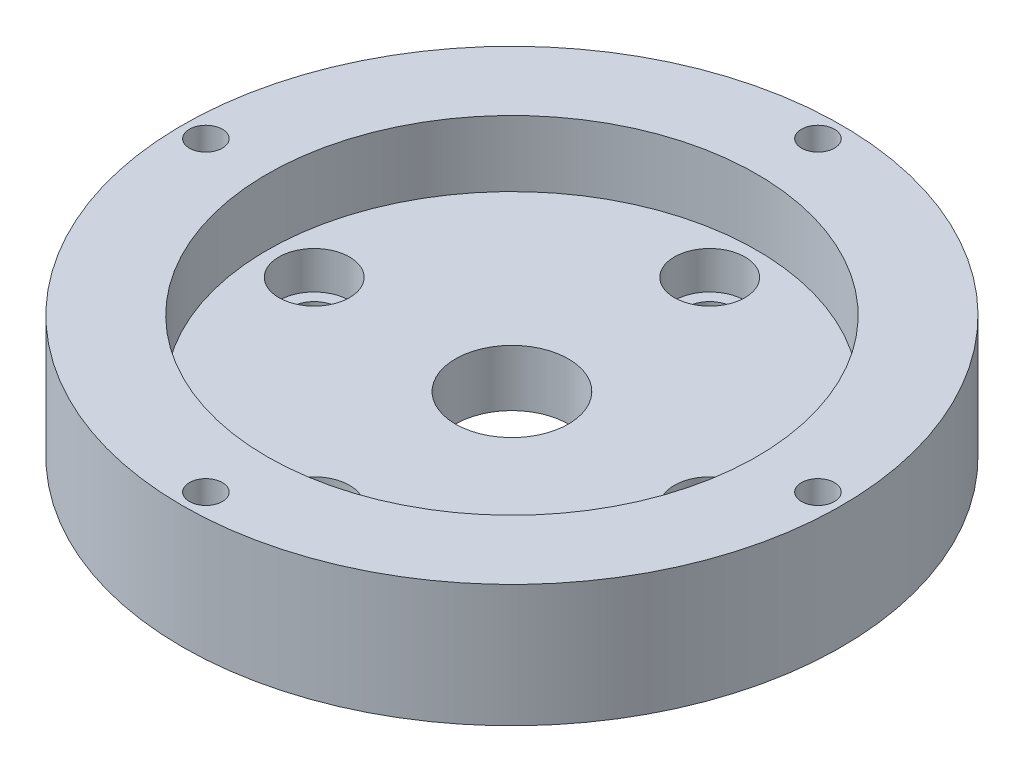
ISO-10303-21;
HEADER;
FILE_DESCRIPTION(('STEP AP214'),'2;1');
FILE_NAME('part.step','',(''),(''),'','','');
FILE_SCHEMA(('AUTOMOTIVE_DESIGN { 1 0 10303 214 1 1 1 1 }'));
ENDSEC;
DATA;
#1=APPLICATION_CONTEXT('core data for automotive mechanical design processes');
#2=APPLICATION_PROTOCOL_DEFINITION('international standard','automotive_design',2000,#1);
#3=PRODUCT_CONTEXT('',#1,'mechanical');
#4=PRODUCT('Part','Part','',(#3));
#5=PRODUCT_RELATED_PRODUCT_CATEGORY('part','',(#4));
#6=PRODUCT_DEFINITION_FORMATION('','',#4);
#7=PRODUCT_DEFINITION_CONTEXT('part definition',#1,'design');
#8=PRODUCT_DEFINITION('design','',#6,#7);
#9=PRODUCT_DEFINITION_SHAPE('','',#8);
#10=(LENGTH_UNIT() NAMED_UNIT(*) SI_UNIT(.MILLI.,.METRE.));
#11=(NAMED_UNIT(*) PLANE_ANGLE_UNIT() SI_UNIT($,.RADIAN.));
#12=(NAMED_UNIT(*) SI_UNIT($,.STERADIAN.) SOLID_ANGLE_UNIT());
#13=UNCERTAINTY_MEASURE_WITH_UNIT(LENGTH_MEASURE(1.E-05),#10,'distance_accuracy_value','');
#14=(GEOMETRIC_REPRESENTATION_CONTEXT(3) GLOBAL_UNCERTAINTY_ASSIGNED_CONTEXT((#13)) GLOBAL_UNIT_ASSIGNED_CONTEXT((#10,
#11,#12)) REPRESENTATION_CONTEXT('',''));
#15=CARTESIAN_POINT('',(0.,0.,0.));
#16=DIRECTION('',(0.,0.,1.));
#17=DIRECTION('',(1.,0.,0.));
#18=AXIS2_PLACEMENT_3D('',#15,#16,#17);
#19=CARTESIAN_POINT('',(-32.5,0.,0.));
#20=DIRECTION('',(0.,1.,0.));
#21=DIRECTION('',(0.,0.,1.));
#22=AXIS2_PLACEMENT_3D('',#19,#20,#21);
#23=CYLINDRICAL_SURFACE('',#22,1.75);
#24=CARTESIAN_POINT('',(-32.5,13.,0.));
#25=DIRECTION('',(0.,1.,0.));
#26=DIRECTION('',(0.,0.,1.));
#27=AXIS2_PLACEMENT_3D('',#24,#25,#26);
#28=CIRCLE('',#27,1.75);
#29=CARTESIAN_POINT('',(-32.5,13.,1.75000000000001));
#30=VERTEX_POINT('',#29);
#31=EDGE_CURVE('E62',#30,#30,#28,.T.);
#32=ORIENTED_EDGE('',*,*,#31,.T.);
#33=EDGE_LOOP('',(#32));
#34=FACE_BOUND('',#33,.T.);
#35=CARTESIAN_POINT('',(-32.5,3.,0.));
#36=DIRECTION('',(0.,-1.,0.));
#37=DIRECTION('',(0.,0.,-1.));
#38=AXIS2_PLACEMENT_3D('',#35,#36,#37);
#39=CIRCLE('',#38,1.75);
#40=CARTESIAN_POINT('',(-32.5,3.,-1.75));
#41=VERTEX_POINT('',#40);
#42=EDGE_CURVE('E36',#41,#41,#39,.F.);
#43=ORIENTED_EDGE('',*,*,#42,.F.);
#44=EDGE_LOOP('',(#43));
#45=FACE_BOUND('',#44,.T.);
#46=ADVANCED_FACE('F32',(#34,#45),#23,.F.);
#47=CARTESIAN_POINT('',(0.,0.,32.5));
#48=DIRECTION('',(0.,1.,0.));
#49=DIRECTION('',(0.,0.,1.));
#50=AXIS2_PLACEMENT_3D('',#47,#48,#49);
#51=CYLINDRICAL_SURFACE('',#50,1.75);
#52=CARTESIAN_POINT('',(0.,13.,32.5));
#53=DIRECTION('',(0.,1.,0.));
#54=DIRECTION('',(0.,0.,1.));
#55=AXIS2_PLACEMENT_3D('',#52,#53,#54);
#56=CIRCLE('',#55,1.75);
#57=CARTESIAN_POINT('',(0.,13.,34.25));
#58=VERTEX_POINT('',#57);
#59=EDGE_CURVE('E66',#58,#58,#56,.T.);
#60=ORIENTED_EDGE('',*,*,#59,.T.);
#61=EDGE_LOOP('',(#60));
#62=FACE_BOUND('',#61,.T.);
#63=CARTESIAN_POINT('',(0.,3.,32.5));
#64=DIRECTION('',(0.,-1.,0.));
#65=DIRECTION('',(0.,0.,-1.));
#66=AXIS2_PLACEMENT_3D('',#63,#64,#65);
#67=CIRCLE('',#66,1.75);
#68=CARTESIAN_POINT('',(0.,3.,30.75));
#69=VERTEX_POINT('',#68);
#70=EDGE_CURVE('E57',#69,#69,#67,.F.);
#71=ORIENTED_EDGE('',*,*,#70,.F.);
#72=EDGE_LOOP('',(#71));
#73=FACE_BOUND('',#72,.T.);
#74=ADVANCED_FACE('F169',(#62,#73),#51,.F.);
#75=CARTESIAN_POINT('',(32.5,0.,0.));
#76=DIRECTION('',(0.,1.,0.));
#77=DIRECTION('',(0.,0.,1.));
#78=AXIS2_PLACEMENT_3D('',#75,#76,#77);
#79=CYLINDRICAL_SURFACE('',#78,1.75);
#80=CARTESIAN_POINT('',(32.5,13.,0.));
#81=DIRECTION('',(0.,1.,0.));
#82=DIRECTION('',(0.,0.,1.));
#83=AXIS2_PLACEMENT_3D('',#80,#81,#82);
#84=CIRCLE('',#83,1.75);
#85=CARTESIAN_POINT('',(32.5,13.,1.75));
#86=VERTEX_POINT('',#85);
#87=EDGE_CURVE('E71',#86,#86,#84,.T.);
#88=ORIENTED_EDGE('',*,*,#87,.T.);
#89=EDGE_LOOP('',(#88));
#90=FACE_BOUND('',#89,.T.);
#91=CARTESIAN_POINT('',(32.5,3.,0.));
#92=DIRECTION('',(0.,-1.,0.));
#93=DIRECTION('',(0.,0.,-1.));
#94=AXIS2_PLACEMENT_3D('',#91,#92,#93);
#95=CIRCLE('',#94,1.75);
#96=CARTESIAN_POINT('',(32.5,3.,-1.75000000000001));
#97=VERTEX_POINT('',#96);
#98=EDGE_CURVE('E54',#97,#97,#95,.F.);
#99=ORIENTED_EDGE('',*,*,#98,.F.);
#100=EDGE_LOOP('',(#99));
#101=FACE_BOUND('',#100,.T.);
#102=ADVANCED_FACE('F163',(#90,#101),#79,.F.);
#103=CARTESIAN_POINT('',(0.,0.,-32.5));
#104=DIRECTION('',(0.,1.,0.));
#105=DIRECTION('',(0.,0.,1.));
#106=AXIS2_PLACEMENT_3D('',#103,#104,#105);
#107=CYLINDRICAL_SURFACE('',#106,1.75);
#108=CARTESIAN_POINT('',(0.,13.,-32.5));
#109=DIRECTION('',(0.,1.,0.));
#110=DIRECTION('',(0.,0.,1.));
#111=AXIS2_PLACEMENT_3D('',#108,#109,#110);
#112=CIRCLE('',#111,1.75);
#113=CARTESIAN_POINT('',(0.,13.,-30.75));
#114=VERTEX_POINT('',#113);
#115=EDGE_CURVE('E79',#114,#114,#112,.T.);
#116=ORIENTED_EDGE('',*,*,#115,.T.);
#117=EDGE_LOOP('',(#116));
#118=FACE_BOUND('',#117,.T.);
#119=CARTESIAN_POINT('',(0.,3.,-32.5));
#120=DIRECTION('',(0.,-1.,0.));
#121=DIRECTION('',(0.,0.,-1.));
#122=AXIS2_PLACEMENT_3D('',#119,#120,#121);
#123=CIRCLE('',#122,1.75);
#124=CARTESIAN_POINT('',(0.,3.,-34.25));
#125=VERTEX_POINT('',#124);
#126=EDGE_CURVE('E51',#125,#125,#123,.F.);
#127=ORIENTED_EDGE('',*,*,#126,.F.);
#128=EDGE_LOOP('',(#127));
#129=FACE_BOUND('',#128,.T.);
#130=ADVANCED_FACE('F155',(#118,#129),#107,.F.);
#131=CARTESIAN_POINT('',(0.,6.,0.));
#132=DIRECTION('',(0.,1.,0.));
#133=DIRECTION('',(0.,0.,1.));
#134=AXIS2_PLACEMENT_3D('',#131,#132,#133);
#135=PLANE('',#134);
#136=CARTESIAN_POINT('',(0.,6.,0.));
#137=DIRECTION('',(0.,1.,0.));
#138=DIRECTION('',(0.,0.,1.));
#139=AXIS2_PLACEMENT_3D('',#136,#137,#138);
#140=CIRCLE('',#139,6.);
#141=CARTESIAN_POINT('',(0.,6.,6.));
#142=VERTEX_POINT('',#141);
#143=EDGE_CURVE('E92',#142,#142,#140,.T.);
#144=ORIENTED_EDGE('',*,*,#143,.F.);
#145=EDGE_LOOP('',(#144));
#146=FACE_BOUND('',#145,.T.);
#147=CARTESIAN_POINT('',(0.,6.,-21.));
#148=DIRECTION('',(0.,1.,0.));
#149=DIRECTION('',(0.,0.,1.));
#150=AXIS2_PLACEMENT_3D('',#147,#148,#149);
#151=CIRCLE('',#150,3.75);
#152=CARTESIAN_POINT('',(0.,6.,-17.25));
#153=VERTEX_POINT('',#152);
#154=EDGE_CURVE('E103',#153,#153,#151,.T.);
#155=ORIENTED_EDGE('',*,*,#154,.F.);
#156=EDGE_LOOP('',(#155));
#157=FACE_BOUND('',#156,.T.);
#158=CARTESIAN_POINT('',(21.,6.,0.));
#159=DIRECTION('',(0.,1.,0.));
#160=DIRECTION('',(0.,0.,1.));
#161=AXIS2_PLACEMENT_3D('',#158,#159,#160);
#162=CIRCLE('',#161,3.75);
#163=CARTESIAN_POINT('',(21.,6.,3.75));
#164=VERTEX_POINT('',#163);
#165=EDGE_CURVE('E109',#164,#164,#162,.T.);
#166=ORIENTED_EDGE('',*,*,#165,.F.);
#167=EDGE_LOOP('',(#166));
#168=FACE_BOUND('',#167,.T.);
#169=CARTESIAN_POINT('',(0.,6.,21.));
#170=DIRECTION('',(0.,1.,0.));
#171=DIRECTION('',(0.,0.,1.));
#172=AXIS2_PLACEMENT_3D('',#169,#170,#171);
#173=CIRCLE('',#172,3.75);
#174=CARTESIAN_POINT('',(0.,6.,24.75));
#175=VERTEX_POINT('',#174);
#176=EDGE_CURVE('E115',#175,#175,#173,.T.);
#177=ORIENTED_EDGE('',*,*,#176,.F.);
#178=EDGE_LOOP('',(#177));
#179=FACE_BOUND('',#178,.T.);
#180=CARTESIAN_POINT('',(-21.,6.,0.));
#181=DIRECTION('',(0.,1.,0.));
#182=DIRECTION('',(0.,0.,1.));
#183=AXIS2_PLACEMENT_3D('',#180,#181,#182);
#184=CIRCLE('',#183,3.75);
#185=CARTESIAN_POINT('',(-21.,6.,3.75));
#186=VERTEX_POINT('',#185);
#187=EDGE_CURVE('E121',#186,#186,#184,.T.);
#188=ORIENTED_EDGE('',*,*,#187,.F.);
#189=EDGE_LOOP('',(#188));
#190=FACE_BOUND('',#189,.T.);
#191=CARTESIAN_POINT('',(0.,6.00000000000001,0.));
#192=DIRECTION('',(0.,1.,0.));
#193=DIRECTION('',(0.,0.,1.));
#194=AXIS2_PLACEMENT_3D('',#191,#192,#193);
#195=CIRCLE('',#194,26.);
#196=CARTESIAN_POINT('',(0.,6.00000000000001,26.));
#197=VERTEX_POINT('',#196);
#198=EDGE_CURVE('E10',#197,#197,#195,.F.);
#199=ORIENTED_EDGE('',*,*,#198,.F.);
#200=EDGE_LOOP('',(#199));
#201=FACE_BOUND('',#200,.T.);
#202=ADVANCED_FACE('F152',(#146,#157,#168,#179,#190,#201),#135,.T.);
#203=CARTESIAN_POINT('',(0.,6.,0.));
#204=DIRECTION('',(0.,-1.,0.));
#205=DIRECTION('',(0.,0.,-1.));
#206=AXIS2_PLACEMENT_3D('',#203,#204,#205);
#207=CYLINDRICAL_SURFACE('',#206,35.);
#208=CARTESIAN_POINT('',(0.,0.,0.));
#209=DIRECTION('',(0.,1.,0.));
#210=DIRECTION('',(0.,0.,1.));
#211=AXIS2_PLACEMENT_3D('',#208,#209,#210);
#212=CIRCLE('',#211,35.);
#213=CARTESIAN_POINT('',(0.,0.,35.));
#214=VERTEX_POINT('',#213);
#215=EDGE_CURVE('E40',#214,#214,#212,.T.);
#216=ORIENTED_EDGE('',*,*,#215,.T.);
#217=EDGE_LOOP('',(#216));
#218=FACE_BOUND('',#217,.T.);
#219=CARTESIAN_POINT('',(0.,13.,0.));
#220=DIRECTION('',(0.,1.,0.));
#221=DIRECTION('',(0.,0.,1.));
#222=AXIS2_PLACEMENT_3D('',#219,#220,#221);
#223=CIRCLE('',#222,35.);
#224=CARTESIAN_POINT('',(0.,13.,35.));
#225=VERTEX_POINT('',#224);
#226=EDGE_CURVE('E78',#225,#225,#223,.T.);
#227=ORIENTED_EDGE('',*,*,#226,.F.);
#228=EDGE_LOOP('',(#227));
#229=FACE_BOUND('',#228,.T.);
#230=ADVANCED_FACE('F34',(#218,#229),#207,.T.);
#231=CARTESIAN_POINT('',(0.,0.,0.));
#232=DIRECTION('',(0.,1.,0.));
#233=DIRECTION('',(0.,0.,1.));
#234=AXIS2_PLACEMENT_3D('',#231,#232,#233);
#235=PLANE('',#234);
#236=CARTESIAN_POINT('',(0.,0.,32.5));
#237=DIRECTION('',(0.,-1.,0.));
#238=DIRECTION('',(0.,0.,-1.));
#239=AXIS2_PLACEMENT_3D('',#236,#237,#238);
#240=CIRCLE('',#239,2.);
#241=CARTESIAN_POINT('',(0.,0.,30.5));
#242=VERTEX_POINT('',#241);
#243=EDGE_CURVE('E448',#242,#242,#240,.T.);
#244=ORIENTED_EDGE('',*,*,#243,.F.);
#245=EDGE_LOOP('',(#244));
#246=FACE_BOUND('',#245,.T.);
#247=CARTESIAN_POINT('',(32.5,0.,0.));
#248=DIRECTION('',(0.,-1.,0.));
#249=DIRECTION('',(0.,0.,-1.));
#250=AXIS2_PLACEMENT_3D('',#247,#248,#249);
#251=CIRCLE('',#250,2.);
#252=CARTESIAN_POINT('',(32.5,0.,-2.00000000000001));
#253=VERTEX_POINT('',#252);
#254=EDGE_CURVE('E452',#253,#253,#251,.T.);
#255=ORIENTED_EDGE('',*,*,#254,.F.);
#256=EDGE_LOOP('',(#255));
#257=FACE_BOUND('',#256,.T.);
#258=CARTESIAN_POINT('',(0.,0.,-32.5));
#259=DIRECTION('',(0.,-1.,0.));
#260=DIRECTION('',(0.,0.,-1.));
#261=AXIS2_PLACEMENT_3D('',#258,#259,#260);
#262=CIRCLE('',#261,2.);
#263=CARTESIAN_POINT('',(0.,0.,-34.5));
#264=VERTEX_POINT('',#263);
#265=EDGE_CURVE('E456',#264,#264,#262,.T.);
#266=ORIENTED_EDGE('',*,*,#265,.F.);
#267=EDGE_LOOP('',(#266));
#268=FACE_BOUND('',#267,.T.);
#269=CARTESIAN_POINT('',(-32.5,0.,0.));
#270=DIRECTION('',(0.,-1.,0.));
#271=DIRECTION('',(0.,0.,-1.));
#272=AXIS2_PLACEMENT_3D('',#269,#270,#271);
#273=CIRCLE('',#272,2.);
#274=CARTESIAN_POINT('',(-32.5,0.,-2.));
#275=VERTEX_POINT('',#274);
#276=EDGE_CURVE('E460',#275,#275,#273,.T.);
#277=ORIENTED_EDGE('',*,*,#276,.F.);
#278=EDGE_LOOP('',(#277));
#279=FACE_BOUND('',#278,.T.);
#280=CARTESIAN_POINT('',(0.,0.,-21.));
#281=DIRECTION('',(0.,1.,0.));
#282=DIRECTION('',(0.,0.,1.));
#283=AXIS2_PLACEMENT_3D('',#280,#281,#282);
#284=CIRCLE('',#283,2.5);
#285=CARTESIAN_POINT('',(0.,0.,-18.5));
#286=VERTEX_POINT('',#285);
#287=EDGE_CURVE('E89',#286,#286,#284,.T.);
#288=ORIENTED_EDGE('',*,*,#287,.T.);
#289=EDGE_LOOP('',(#288));
#290=FACE_BOUND('',#289,.T.);
#291=CARTESIAN_POINT('',(21.,0.,0.));
#292=DIRECTION('',(0.,1.,0.));
#293=DIRECTION('',(0.,0.,1.));
#294=AXIS2_PLACEMENT_3D('',#291,#292,#293);
#295=CIRCLE('',#294,2.5);
#296=CARTESIAN_POINT('',(21.,0.,2.5));
#297=VERTEX_POINT('',#296);
#298=EDGE_CURVE('E86',#297,#297,#295,.T.);
#299=ORIENTED_EDGE('',*,*,#298,.T.);
#300=EDGE_LOOP('',(#299));
#301=FACE_BOUND('',#300,.T.);
#302=CARTESIAN_POINT('',(0.,0.,21.));
#303=DIRECTION('',(0.,1.,0.));
#304=DIRECTION('',(0.,0.,1.));
#305=AXIS2_PLACEMENT_3D('',#302,#303,#304);
#306=CIRCLE('',#305,2.5);
#307=CARTESIAN_POINT('',(0.,0.,23.5));
#308=VERTEX_POINT('',#307);
#309=EDGE_CURVE('E83',#308,#308,#306,.T.);
#310=ORIENTED_EDGE('',*,*,#309,.T.);
#311=EDGE_LOOP('',(#310));
#312=FACE_BOUND('',#311,.T.);
#313=CARTESIAN_POINT('',(-21.,0.,0.));
#314=DIRECTION('',(0.,1.,0.));
#315=DIRECTION('',(0.,0.,1.));
#316=AXIS2_PLACEMENT_3D('',#313,#314,#315);
#317=CIRCLE('',#316,2.5);
#318=CARTESIAN_POINT('',(-21.,0.,2.5));
#319=VERTEX_POINT('',#318);
#320=EDGE_CURVE('E82',#319,#319,#317,.T.);
#321=ORIENTED_EDGE('',*,*,#320,.T.);
#322=EDGE_LOOP('',(#321));
#323=FACE_BOUND('',#322,.T.);
#324=CARTESIAN_POINT('',(0.,0.,0.));
#325=DIRECTION('',(0.,1.,0.));
#326=DIRECTION('',(0.,0.,1.));
#327=AXIS2_PLACEMENT_3D('',#324,#325,#326);
#328=CIRCLE('',#327,6.);
#329=CARTESIAN_POINT('',(0.,0.,6.));
#330=VERTEX_POINT('',#329);
#331=EDGE_CURVE('E95',#330,#330,#328,.T.);
#332=ORIENTED_EDGE('',*,*,#331,.T.);
#333=EDGE_LOOP('',(#332));
#334=FACE_BOUND('',#333,.T.);
#335=ORIENTED_EDGE('',*,*,#215,.F.);
#336=EDGE_LOOP('',(#335));
#337=FACE_BOUND('',#336,.T.);
#338=ADVANCED_FACE('F148',(#246,#257,#268,#279,#290,#301,#312,#323,#334,#337),#235,.F.);
#339=CARTESIAN_POINT('',(-21.,2.,0.));
#340=DIRECTION('',(0.,1.,0.));
#341=DIRECTION('',(0.,0.,1.));
#342=AXIS2_PLACEMENT_3D('',#339,#340,#341);
#343=CYLINDRICAL_SURFACE('',#342,3.75);
#344=CARTESIAN_POINT('',(-21.,2.,0.));
#345=DIRECTION('',(0.,1.,0.));
#346=DIRECTION('',(0.,0.,1.));
#347=AXIS2_PLACEMENT_3D('',#344,#345,#346);
#348=CIRCLE('',#347,3.75);
#349=CARTESIAN_POINT('',(-21.,2.,3.75));
#350=VERTEX_POINT('',#349);
#351=EDGE_CURVE('E118',#350,#350,#348,.T.);
#352=ORIENTED_EDGE('',*,*,#351,.F.);
#353=EDGE_LOOP('',(#352));
#354=FACE_BOUND('',#353,.T.);
#355=ORIENTED_EDGE('',*,*,#187,.T.);
#356=EDGE_LOOP('',(#355));
#357=FACE_BOUND('',#356,.T.);
#358=ADVANCED_FACE('F142',(#354,#357),#343,.F.);
#359=CARTESIAN_POINT('',(-21.,2.,0.));
#360=DIRECTION('',(0.,1.,0.));
#361=DIRECTION('',(0.,0.,1.));
#362=AXIS2_PLACEMENT_3D('',#359,#360,#361);
#363=PLANE('',#362);
#364=CARTESIAN_POINT('',(-21.,2.,0.));
#365=DIRECTION('',(0.,1.,0.));
#366=DIRECTION('',(0.,0.,1.));
#367=AXIS2_PLACEMENT_3D('',#364,#365,#366);
#368=CIRCLE('',#367,2.5);
#369=CARTESIAN_POINT('',(-21.,2.,2.5));
#370=VERTEX_POINT('',#369);
#371=EDGE_CURVE('E49',#370,#370,#368,.T.);
#372=ORIENTED_EDGE('',*,*,#371,.F.);
#373=EDGE_LOOP('',(#372));
#374=FACE_BOUND('',#373,.T.);
#375=ORIENTED_EDGE('',*,*,#351,.T.);
#376=EDGE_LOOP('',(#375));
#377=FACE_BOUND('',#376,.T.);
#378=ADVANCED_FACE('F138',(#374,#377),#363,.T.);
#379=CARTESIAN_POINT('',(0.,2.,21.));
#380=DIRECTION('',(0.,1.,0.));
#381=DIRECTION('',(0.,0.,1.));
#382=AXIS2_PLACEMENT_3D('',#379,#380,#381);
#383=CYLINDRICAL_SURFACE('',#382,3.75);
#384=CARTESIAN_POINT('',(0.,2.,21.));
#385=DIRECTION('',(0.,1.,0.));
#386=DIRECTION('',(0.,0.,1.));
#387=AXIS2_PLACEMENT_3D('',#384,#385,#386);
#388=CIRCLE('',#387,3.75);
#389=CARTESIAN_POINT('',(0.,2.,24.75));
#390=VERTEX_POINT('',#389);
#391=EDGE_CURVE('E112',#390,#390,#388,.T.);
#392=ORIENTED_EDGE('',*,*,#391,.F.);
#393=EDGE_LOOP('',(#392));
#394=FACE_BOUND('',#393,.T.);
#395=ORIENTED_EDGE('',*,*,#176,.T.);
#396=EDGE_LOOP('',(#395));
#397=FACE_BOUND('',#396,.T.);
#398=ADVANCED_FACE('F141',(#394,#397),#383,.F.);
#399=CARTESIAN_POINT('',(0.,2.,21.));
#400=DIRECTION('',(0.,1.,0.));
#401=DIRECTION('',(0.,0.,1.));
#402=AXIS2_PLACEMENT_3D('',#399,#400,#401);
#403=PLANE('',#402);
#404=CARTESIAN_POINT('',(0.,2.,21.));
#405=DIRECTION('',(0.,1.,0.));
#406=DIRECTION('',(0.,0.,1.));
#407=AXIS2_PLACEMENT_3D('',#404,#405,#406);
#408=CIRCLE('',#407,2.5);
#409=CARTESIAN_POINT('',(0.,2.,23.5));
#410=VERTEX_POINT('',#409);
#411=EDGE_CURVE('E128',#410,#410,#408,.T.);
#412=ORIENTED_EDGE('',*,*,#411,.F.);
#413=EDGE_LOOP('',(#412));
#414=FACE_BOUND('',#413,.T.);
#415=ORIENTED_EDGE('',*,*,#391,.T.);
#416=EDGE_LOOP('',(#415));
#417=FACE_BOUND('',#416,.T.);
#418=ADVANCED_FACE('F219',(#414,#417),#403,.T.);
#419=CARTESIAN_POINT('',(21.,2.,0.));
#420=DIRECTION('',(0.,1.,0.));
#421=DIRECTION('',(0.,0.,1.));
#422=AXIS2_PLACEMENT_3D('',#419,#420,#421);
#423=CYLINDRICAL_SURFACE('',#422,3.75);
#424=CARTESIAN_POINT('',(21.,2.,0.));
#425=DIRECTION('',(0.,1.,0.));
#426=DIRECTION('',(0.,0.,1.));
#427=AXIS2_PLACEMENT_3D('',#424,#425,#426);
#428=CIRCLE('',#427,3.75);
#429=CARTESIAN_POINT('',(21.,2.,3.75));
#430=VERTEX_POINT('',#429);
#431=EDGE_CURVE('E106',#430,#430,#428,.T.);
#432=ORIENTED_EDGE('',*,*,#431,.F.);
#433=EDGE_LOOP('',(#432));
#434=FACE_BOUND('',#433,.T.);
#435=ORIENTED_EDGE('',*,*,#165,.T.);
#436=EDGE_LOOP('',(#435));
#437=FACE_BOUND('',#436,.T.);
#438=ADVANCED_FACE('F215',(#434,#437),#423,.F.);
#439=CARTESIAN_POINT('',(21.,2.,0.));
#440=DIRECTION('',(0.,1.,0.));
#441=DIRECTION('',(0.,0.,1.));
#442=AXIS2_PLACEMENT_3D('',#439,#440,#441);
#443=PLANE('',#442);
#444=CARTESIAN_POINT('',(21.,2.,0.));
#445=DIRECTION('',(0.,1.,0.));
#446=DIRECTION('',(0.,0.,1.));
#447=AXIS2_PLACEMENT_3D('',#444,#445,#446);
#448=CIRCLE('',#447,2.5);
#449=CARTESIAN_POINT('',(21.,2.,2.5));
#450=VERTEX_POINT('',#449);
#451=EDGE_CURVE('E126',#450,#450,#448,.T.);
#452=ORIENTED_EDGE('',*,*,#451,.F.);
#453=EDGE_LOOP('',(#452));
#454=FACE_BOUND('',#453,.T.);
#455=ORIENTED_EDGE('',*,*,#431,.T.);
#456=EDGE_LOOP('',(#455));
#457=FACE_BOUND('',#456,.T.);
#458=ADVANCED_FACE('F211',(#454,#457),#443,.T.);
#459=CARTESIAN_POINT('',(0.,2.,-21.));
#460=DIRECTION('',(0.,1.,0.));
#461=DIRECTION('',(0.,0.,1.));
#462=AXIS2_PLACEMENT_3D('',#459,#460,#461);
#463=CYLINDRICAL_SURFACE('',#462,3.75);
#464=CARTESIAN_POINT('',(0.,2.,-21.));
#465=DIRECTION('',(0.,1.,0.));
#466=DIRECTION('',(0.,0.,1.));
#467=AXIS2_PLACEMENT_3D('',#464,#465,#466);
#468=CIRCLE('',#467,3.75);
#469=CARTESIAN_POINT('',(0.,2.,-17.25));
#470=VERTEX_POINT('',#469);
#471=EDGE_CURVE('E45',#470,#470,#468,.T.);
#472=ORIENTED_EDGE('',*,*,#471,.F.);
#473=EDGE_LOOP('',(#472));
#474=FACE_BOUND('',#473,.T.);
#475=ORIENTED_EDGE('',*,*,#154,.T.);
#476=EDGE_LOOP('',(#475));
#477=FACE_BOUND('',#476,.T.);
#478=ADVANCED_FACE('F207',(#474,#477),#463,.F.);
#479=CARTESIAN_POINT('',(0.,2.,-21.));
#480=DIRECTION('',(0.,1.,0.));
#481=DIRECTION('',(0.,0.,1.));
#482=AXIS2_PLACEMENT_3D('',#479,#480,#481);
#483=PLANE('',#482);
#484=CARTESIAN_POINT('',(0.,2.,-21.));
#485=DIRECTION('',(0.,1.,0.));
#486=DIRECTION('',(0.,0.,1.));
#487=AXIS2_PLACEMENT_3D('',#484,#485,#486);
#488=CIRCLE('',#487,2.5);
#489=CARTESIAN_POINT('',(0.,2.,-18.5));
#490=VERTEX_POINT('',#489);
#491=EDGE_CURVE('E98',#490,#490,#488,.T.);
#492=ORIENTED_EDGE('',*,*,#491,.F.);
#493=EDGE_LOOP('',(#492));
#494=FACE_BOUND('',#493,.T.);
#495=ORIENTED_EDGE('',*,*,#471,.T.);
#496=EDGE_LOOP('',(#495));
#497=FACE_BOUND('',#496,.T.);
#498=ADVANCED_FACE('F197',(#494,#497),#483,.T.);
#499=CARTESIAN_POINT('',(0.,0.,-21.));
#500=DIRECTION('',(0.,1.,0.));
#501=DIRECTION('',(0.,0.,1.));
#502=AXIS2_PLACEMENT_3D('',#499,#500,#501);
#503=CYLINDRICAL_SURFACE('',#502,2.5);
#504=ORIENTED_EDGE('',*,*,#491,.T.);
#505=EDGE_LOOP('',(#504));
#506=FACE_BOUND('',#505,.T.);
#507=ORIENTED_EDGE('',*,*,#287,.F.);
#508=EDGE_LOOP('',(#507));
#509=FACE_BOUND('',#508,.T.);
#510=ADVANCED_FACE('F194',(#506,#509),#503,.F.);
#511=CARTESIAN_POINT('',(21.,0.,0.));
#512=DIRECTION('',(0.,1.,0.));
#513=DIRECTION('',(0.,0.,1.));
#514=AXIS2_PLACEMENT_3D('',#511,#512,#513);
#515=CYLINDRICAL_SURFACE('',#514,2.5);
#516=ORIENTED_EDGE('',*,*,#451,.T.);
#517=EDGE_LOOP('',(#516));
#518=FACE_BOUND('',#517,.T.);
#519=ORIENTED_EDGE('',*,*,#298,.F.);
#520=EDGE_LOOP('',(#519));
#521=FACE_BOUND('',#520,.T.);
#522=ADVANCED_FACE('F191',(#518,#521),#515,.F.);
#523=CARTESIAN_POINT('',(0.,0.,21.));
#524=DIRECTION('',(0.,1.,0.));
#525=DIRECTION('',(0.,0.,1.));
#526=AXIS2_PLACEMENT_3D('',#523,#524,#525);
#527=CYLINDRICAL_SURFACE('',#526,2.5);
#528=ORIENTED_EDGE('',*,*,#411,.T.);
#529=EDGE_LOOP('',(#528));
#530=FACE_BOUND('',#529,.T.);
#531=ORIENTED_EDGE('',*,*,#309,.F.);
#532=EDGE_LOOP('',(#531));
#533=FACE_BOUND('',#532,.T.);
#534=ADVANCED_FACE('F188',(#530,#533),#527,.F.);
#535=CARTESIAN_POINT('',(-21.,0.,0.));
#536=DIRECTION('',(0.,1.,0.));
#537=DIRECTION('',(0.,0.,1.));
#538=AXIS2_PLACEMENT_3D('',#535,#536,#537);
#539=CYLINDRICAL_SURFACE('',#538,2.5);
#540=ORIENTED_EDGE('',*,*,#371,.T.);
#541=EDGE_LOOP('',(#540));
#542=FACE_BOUND('',#541,.T.);
#543=ORIENTED_EDGE('',*,*,#320,.F.);
#544=EDGE_LOOP('',(#543));
#545=FACE_BOUND('',#544,.T.);
#546=ADVANCED_FACE('F135',(#542,#545),#539,.F.);
#547=CARTESIAN_POINT('',(0.,0.,0.));
#548=DIRECTION('',(0.,1.,0.));
#549=DIRECTION('',(0.,0.,1.));
#550=AXIS2_PLACEMENT_3D('',#547,#548,#549);
#551=CYLINDRICAL_SURFACE('',#550,6.);
#552=ORIENTED_EDGE('',*,*,#331,.F.);
#553=EDGE_LOOP('',(#552));
#554=FACE_BOUND('',#553,.T.);
#555=ORIENTED_EDGE('',*,*,#143,.T.);
#556=EDGE_LOOP('',(#555));
#557=FACE_BOUND('',#556,.T.);
#558=ADVANCED_FACE('F186',(#554,#557),#551,.F.);
#559=CARTESIAN_POINT('',(0.,13.,0.));
#560=DIRECTION('',(0.,1.,0.));
#561=DIRECTION('',(0.,0.,1.));
#562=AXIS2_PLACEMENT_3D('',#559,#560,#561);
#563=PLANE('',#562);
#564=ORIENTED_EDGE('',*,*,#115,.F.);
#565=EDGE_LOOP('',(#564));
#566=FACE_BOUND('',#565,.T.);
#567=ORIENTED_EDGE('',*,*,#87,.F.);
#568=EDGE_LOOP('',(#567));
#569=FACE_BOUND('',#568,.T.);
#570=ORIENTED_EDGE('',*,*,#59,.F.);
#571=EDGE_LOOP('',(#570));
#572=FACE_BOUND('',#571,.T.);
#573=ORIENTED_EDGE('',*,*,#31,.F.);
#574=EDGE_LOOP('',(#573));
#575=FACE_BOUND('',#574,.T.);
#576=ORIENTED_EDGE('',*,*,#226,.T.);
#577=EDGE_LOOP('',(#576));
#578=FACE_BOUND('',#577,.T.);
#579=CARTESIAN_POINT('',(0.,13.,0.));
#580=DIRECTION('',(0.,1.,0.));
#581=DIRECTION('',(0.,0.,1.));
#582=AXIS2_PLACEMENT_3D('',#579,#580,#581);
#583=CIRCLE('',#582,26.);
#584=CARTESIAN_POINT('',(0.,13.,26.));
#585=VERTEX_POINT('',#584);
#586=EDGE_CURVE('E75',#585,#585,#583,.T.);
#587=ORIENTED_EDGE('',*,*,#586,.F.);
#588=EDGE_LOOP('',(#587));
#589=FACE_BOUND('',#588,.T.);
#590=ADVANCED_FACE('F183',(#566,#569,#572,#575,#578,#589),#563,.T.);
#591=CARTESIAN_POINT('',(0.,97.8528137423857,0.));
#592=DIRECTION('',(0.,-1.,0.));
#593=DIRECTION('',(0.,0.,-1.));
#594=AXIS2_PLACEMENT_3D('',#591,#592,#593);
#595=CYLINDRICAL_SURFACE('',#594,26.);
#596=ORIENTED_EDGE('',*,*,#198,.T.);
#597=EDGE_LOOP('',(#596));
#598=FACE_BOUND('',#597,.T.);
#599=ORIENTED_EDGE('',*,*,#586,.T.);
#600=EDGE_LOOP('',(#599));
#601=FACE_BOUND('',#600,.T.);
#602=ADVANCED_FACE('F179',(#598,#601),#595,.F.);
#603=CARTESIAN_POINT('',(0.,3.,-32.5));
#604=DIRECTION('',(0.,-1.,0.));
#605=DIRECTION('',(0.,0.,-1.));
#606=AXIS2_PLACEMENT_3D('',#603,#604,#605);
#607=PLANE('',#606);
#608=CARTESIAN_POINT('',(0.,3.,-32.5));
#609=DIRECTION('',(0.,-1.,0.));
#610=DIRECTION('',(0.,0.,-1.));
#611=AXIS2_PLACEMENT_3D('',#608,#609,#610);
#612=CIRCLE('',#611,2.);
#613=CARTESIAN_POINT('',(0.,3.,-34.5));
#614=VERTEX_POINT('',#613);
#615=EDGE_CURVE('E505',#614,#614,#612,.T.);
#616=ORIENTED_EDGE('',*,*,#615,.T.);
#617=EDGE_LOOP('',(#616));
#618=FACE_BOUND('',#617,.T.);
#619=ORIENTED_EDGE('',*,*,#126,.T.);
#620=EDGE_LOOP('',(#619));
#621=FACE_BOUND('',#620,.T.);
#622=ADVANCED_FACE('F182',(#618,#621),#607,.T.);
#623=CARTESIAN_POINT('',(0.,3.,-32.5));
#624=DIRECTION('',(0.,-1.,0.));
#625=DIRECTION('',(0.,0.,-1.));
#626=AXIS2_PLACEMENT_3D('',#623,#624,#625);
#627=CYLINDRICAL_SURFACE('',#626,2.);
#628=ORIENTED_EDGE('',*,*,#615,.F.);
#629=EDGE_LOOP('',(#628));
#630=FACE_BOUND('',#629,.T.);
#631=ORIENTED_EDGE('',*,*,#265,.T.);
#632=EDGE_LOOP('',(#631));
#633=FACE_BOUND('',#632,.T.);
#634=ADVANCED_FACE('F291',(#630,#633),#627,.F.);
#635=CARTESIAN_POINT('',(32.5,3.,0.));
#636=DIRECTION('',(0.,-1.,0.));
#637=DIRECTION('',(0.,0.,-1.));
#638=AXIS2_PLACEMENT_3D('',#635,#636,#637);
#639=PLANE('',#638);
#640=CARTESIAN_POINT('',(32.5,3.,0.));
#641=DIRECTION('',(0.,-1.,0.));
#642=DIRECTION('',(0.,0.,-1.));
#643=AXIS2_PLACEMENT_3D('',#640,#641,#642);
#644=CIRCLE('',#643,2.);
#645=CARTESIAN_POINT('',(32.5,3.,-2.00000000000001));
#646=VERTEX_POINT('',#645);
#647=EDGE_CURVE('E509',#646,#646,#644,.T.);
#648=ORIENTED_EDGE('',*,*,#647,.T.);
#649=EDGE_LOOP('',(#648));
#650=FACE_BOUND('',#649,.T.);
#651=ORIENTED_EDGE('',*,*,#98,.T.);
#652=EDGE_LOOP('',(#651));
#653=FACE_BOUND('',#652,.T.);
#654=ADVANCED_FACE('F300',(#650,#653),#639,.T.);
#655=CARTESIAN_POINT('',(32.5,3.,0.));
#656=DIRECTION('',(0.,-1.,0.));
#657=DIRECTION('',(0.,0.,-1.));
#658=AXIS2_PLACEMENT_3D('',#655,#656,#657);
#659=CYLINDRICAL_SURFACE('',#658,2.);
#660=ORIENTED_EDGE('',*,*,#647,.F.);
#661=EDGE_LOOP('',(#660));
#662=FACE_BOUND('',#661,.T.);
#663=ORIENTED_EDGE('',*,*,#254,.T.);
#664=EDGE_LOOP('',(#663));
#665=FACE_BOUND('',#664,.T.);
#666=ADVANCED_FACE('F308',(#662,#665),#659,.F.);
#667=CARTESIAN_POINT('',(0.,3.,32.5));
#668=DIRECTION('',(0.,-1.,0.));
#669=DIRECTION('',(0.,0.,-1.));
#670=AXIS2_PLACEMENT_3D('',#667,#668,#669);
#671=PLANE('',#670);
#672=CARTESIAN_POINT('',(0.,3.,32.5));
#673=DIRECTION('',(0.,-1.,0.));
#674=DIRECTION('',(0.,0.,-1.));
#675=AXIS2_PLACEMENT_3D('',#672,#673,#674);
#676=CIRCLE('',#675,2.);
#677=CARTESIAN_POINT('',(0.,3.,30.5));
#678=VERTEX_POINT('',#677);
#679=EDGE_CURVE('E55',#678,#678,#676,.T.);
#680=ORIENTED_EDGE('',*,*,#679,.T.);
#681=EDGE_LOOP('',(#680));
#682=FACE_BOUND('',#681,.T.);
#683=ORIENTED_EDGE('',*,*,#70,.T.);
#684=EDGE_LOOP('',(#683));
#685=FACE_BOUND('',#684,.T.);
#686=ADVANCED_FACE('F316',(#682,#685),#671,.T.);
#687=CARTESIAN_POINT('',(0.,3.,32.5));
#688=DIRECTION('',(0.,-1.,0.));
#689=DIRECTION('',(0.,0.,-1.));
#690=AXIS2_PLACEMENT_3D('',#687,#688,#689);
#691=CYLINDRICAL_SURFACE('',#690,2.);
#692=ORIENTED_EDGE('',*,*,#679,.F.);
#693=EDGE_LOOP('',(#692));
#694=FACE_BOUND('',#693,.T.);
#695=ORIENTED_EDGE('',*,*,#243,.T.);
#696=EDGE_LOOP('',(#695));
#697=FACE_BOUND('',#696,.T.);
#698=ADVANCED_FACE('F324',(#694,#697),#691,.F.);
#699=CARTESIAN_POINT('',(-32.5,3.,0.));
#700=DIRECTION('',(0.,-1.,0.));
#701=DIRECTION('',(0.,0.,-1.));
#702=AXIS2_PLACEMENT_3D('',#699,#700,#701);
#703=PLANE('',#702);
#704=CARTESIAN_POINT('',(-32.5,3.,0.));
#705=DIRECTION('',(0.,-1.,0.));
#706=DIRECTION('',(0.,0.,-1.));
#707=AXIS2_PLACEMENT_3D('',#704,#705,#706);
#708=CIRCLE('',#707,2.);
#709=CARTESIAN_POINT('',(-32.5,3.,-2.));
#710=VERTEX_POINT('',#709);
#711=EDGE_CURVE('E483',#710,#710,#708,.T.);
#712=ORIENTED_EDGE('',*,*,#711,.T.);
#713=EDGE_LOOP('',(#712));
#714=FACE_BOUND('',#713,.T.);
#715=ORIENTED_EDGE('',*,*,#42,.T.);
#716=EDGE_LOOP('',(#715));
#717=FACE_BOUND('',#716,.T.);
#718=ADVANCED_FACE('F332',(#714,#717),#703,.T.);
#719=CARTESIAN_POINT('',(-32.5,3.,0.));
#720=DIRECTION('',(0.,-1.,0.));
#721=DIRECTION('',(0.,0.,-1.));
#722=AXIS2_PLACEMENT_3D('',#719,#720,#721);
#723=CYLINDRICAL_SURFACE('',#722,2.);
#724=ORIENTED_EDGE('',*,*,#711,.F.);
#725=EDGE_LOOP('',(#724));
#726=FACE_BOUND('',#725,.T.);
#727=ORIENTED_EDGE('',*,*,#276,.T.);
#728=EDGE_LOOP('',(#727));
#729=FACE_BOUND('',#728,.T.);
#730=ADVANCED_FACE('F340',(#726,#729),#723,.F.);
#731=CLOSED_SHELL('',(#46,#74,#102,#130,#202,#230,#338,#358,#378,#398,#418,#438,#458,#478,#498,
#510,#522,#534,#546,#558,#590,#602,#622,#634,#654,#666,#686,#698,#718,#730));
#732=MANIFOLD_SOLID_BREP('B2',#731);
#733=ADVANCED_BREP_SHAPE_REPRESENTATION('',(#18,#732),#14);
#734=SHAPE_DEFINITION_REPRESENTATION(#9,#733);
ENDSEC;
END-ISO-10303-21;
